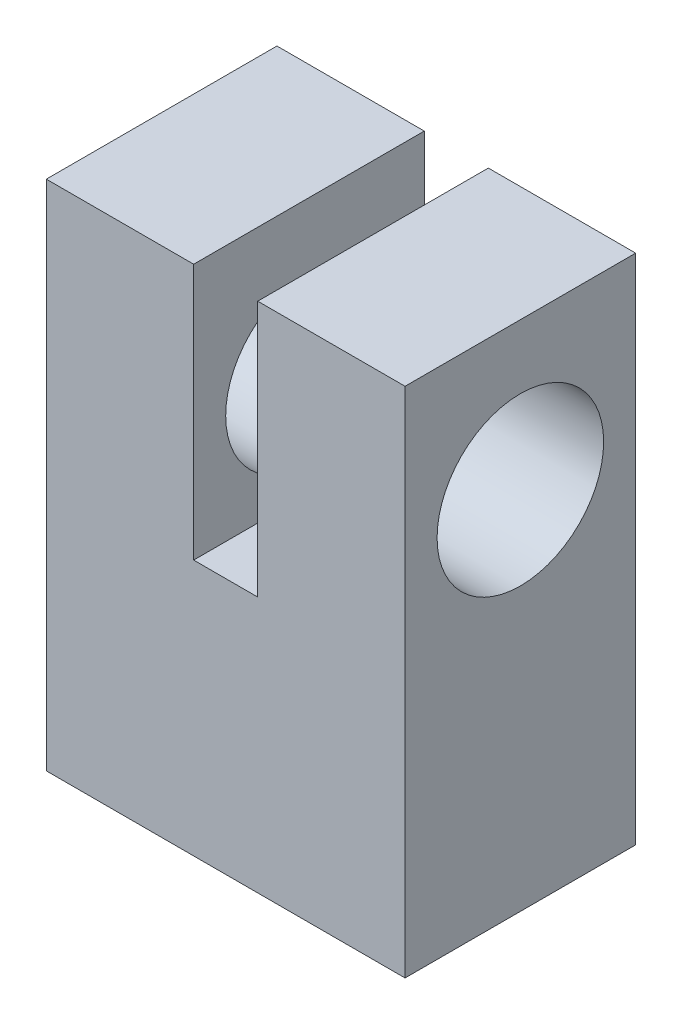
ISO-10303-21;
HEADER;
FILE_DESCRIPTION(('STEP AP214'),'2;1');
FILE_NAME('part.step','',(''),(''),'','','');
FILE_SCHEMA(('AUTOMOTIVE_DESIGN { 1 0 10303 214 1 1 1 1 }'));
ENDSEC;
DATA;
#1=APPLICATION_CONTEXT('core data for automotive mechanical design processes');
#2=APPLICATION_PROTOCOL_DEFINITION('international standard','automotive_design',2000,#1);
#3=PRODUCT_CONTEXT('',#1,'mechanical');
#4=PRODUCT('Part','Part','',(#3));
#5=PRODUCT_RELATED_PRODUCT_CATEGORY('part','',(#4));
#6=PRODUCT_DEFINITION_FORMATION('','',#4);
#7=PRODUCT_DEFINITION_CONTEXT('part definition',#1,'design');
#8=PRODUCT_DEFINITION('design','',#6,#7);
#9=PRODUCT_DEFINITION_SHAPE('','',#8);
#10=(LENGTH_UNIT() NAMED_UNIT(*) SI_UNIT(.MILLI.,.METRE.));
#11=(NAMED_UNIT(*) PLANE_ANGLE_UNIT() SI_UNIT($,.RADIAN.));
#12=(NAMED_UNIT(*) SI_UNIT($,.STERADIAN.) SOLID_ANGLE_UNIT());
#13=UNCERTAINTY_MEASURE_WITH_UNIT(LENGTH_MEASURE(1.E-05),#10,'distance_accuracy_value','');
#14=(GEOMETRIC_REPRESENTATION_CONTEXT(3) GLOBAL_UNCERTAINTY_ASSIGNED_CONTEXT((#13)) GLOBAL_UNIT_ASSIGNED_CONTEXT((#10,
#11,#12)) REPRESENTATION_CONTEXT('',''));
#15=CARTESIAN_POINT('',(0.,0.,0.));
#16=DIRECTION('',(0.,0.,1.));
#17=DIRECTION('',(1.,0.,0.));
#18=AXIS2_PLACEMENT_3D('',#15,#16,#17);
#19=CARTESIAN_POINT('',(0.,40.,0.));
#20=DIRECTION('',(0.,1.,0.));
#21=DIRECTION('',(0.,0.,1.));
#22=AXIS2_PLACEMENT_3D('',#19,#20,#21);
#23=PLANE('',#22);
#24=DIRECTION('',(0.,0.,1.));
#25=VECTOR('',#24,1.);
#26=CARTESIAN_POINT('',(16.5,40.,-18.));
#27=LINE('',#26,#25);
#28=CARTESIAN_POINT('',(16.5,40.,-18.));
#29=VERTEX_POINT('',#28);
#30=CARTESIAN_POINT('',(16.5,40.,0.));
#31=VERTEX_POINT('',#30);
#32=EDGE_CURVE('E151',#29,#31,#27,.T.);
#33=ORIENTED_EDGE('',*,*,#32,.T.);
#34=DIRECTION('',(1.,0.,0.));
#35=VECTOR('',#34,1.);
#36=CARTESIAN_POINT('',(0.,40.,0.));
#37=LINE('',#36,#35);
#38=CARTESIAN_POINT('',(28.,40.,0.));
#39=VERTEX_POINT('',#38);
#40=EDGE_CURVE('E183',#31,#39,#37,.T.);
#41=ORIENTED_EDGE('',*,*,#40,.T.);
#42=DIRECTION('',(0.,0.,-1.));
#43=VECTOR('',#42,1.);
#44=CARTESIAN_POINT('',(28.,40.,0.));
#45=LINE('',#44,#43);
#46=CARTESIAN_POINT('',(28.,40.,-18.));
#47=VERTEX_POINT('',#46);
#48=EDGE_CURVE('E185',#39,#47,#45,.T.);
#49=ORIENTED_EDGE('',*,*,#48,.T.);
#50=DIRECTION('',(-1.,0.,0.));
#51=VECTOR('',#50,1.);
#52=CARTESIAN_POINT('',(28.,40.,-18.));
#53=LINE('',#52,#51);
#54=EDGE_CURVE('E187',#47,#29,#53,.T.);
#55=ORIENTED_EDGE('',*,*,#54,.T.);
#56=EDGE_LOOP('',(#33,#41,#49,#55));
#57=FACE_BOUND('',#56,.T.);
#58=ADVANCED_FACE('F48',(#57),#23,.T.);
#59=CARTESIAN_POINT('',(0.,40.,-18.));
#60=DIRECTION('',(1.,0.,0.));
#61=DIRECTION('',(0.,0.,-1.));
#62=AXIS2_PLACEMENT_3D('',#59,#60,#61);
#63=PLANE('',#62);
#64=DIRECTION('',(0.,0.,1.));
#65=VECTOR('',#64,1.);
#66=CARTESIAN_POINT('',(0.,0.,-18.));
#67=LINE('',#66,#65);
#68=CARTESIAN_POINT('',(0.,0.,-18.));
#69=VERTEX_POINT('',#68);
#70=CARTESIAN_POINT('',(0.,0.,0.));
#71=VERTEX_POINT('',#70);
#72=EDGE_CURVE('E178',#69,#71,#67,.T.);
#73=ORIENTED_EDGE('',*,*,#72,.T.);
#74=DIRECTION('',(0.,-1.,0.));
#75=VECTOR('',#74,1.);
#76=CARTESIAN_POINT('',(0.,40.,0.));
#77=LINE('',#76,#75);
#78=CARTESIAN_POINT('',(0.,40.,0.));
#79=VERTEX_POINT('',#78);
#80=EDGE_CURVE('E13',#79,#71,#77,.T.);
#81=ORIENTED_EDGE('',*,*,#80,.F.);
#82=DIRECTION('',(0.,0.,1.));
#83=VECTOR('',#82,1.);
#84=CARTESIAN_POINT('',(0.,40.,-18.));
#85=LINE('',#84,#83);
#86=CARTESIAN_POINT('',(0.,40.,-18.));
#87=VERTEX_POINT('',#86);
#88=EDGE_CURVE('E181',#87,#79,#85,.T.);
#89=ORIENTED_EDGE('',*,*,#88,.F.);
#90=DIRECTION('',(0.,-1.,0.));
#91=VECTOR('',#90,1.);
#92=CARTESIAN_POINT('',(0.,40.,-18.));
#93=LINE('',#92,#91);
#94=EDGE_CURVE('E190',#87,#69,#93,.T.);
#95=ORIENTED_EDGE('',*,*,#94,.T.);
#96=EDGE_LOOP('',(#73,#81,#89,#95));
#97=FACE_BOUND('',#96,.T.);
#98=CARTESIAN_POINT('',(0.,28.5,-9.));
#99=DIRECTION('',(-1.,0.,0.));
#100=DIRECTION('',(0.,0.,1.));
#101=AXIS2_PLACEMENT_3D('',#98,#99,#100);
#102=CIRCLE('',#101,6.5);
#103=CARTESIAN_POINT('',(0.,28.5,-2.5));
#104=VERTEX_POINT('',#103);
#105=EDGE_CURVE('E448',#104,#104,#102,.T.);
#106=ORIENTED_EDGE('',*,*,#105,.F.);
#107=EDGE_LOOP('',(#106));
#108=FACE_BOUND('',#107,.T.);
#109=ADVANCED_FACE('F50',(#97,#108),#63,.F.);
#110=CARTESIAN_POINT('',(0.,40.,0.));
#111=DIRECTION('',(0.,0.,-1.));
#112=DIRECTION('',(-1.,0.,0.));
#113=AXIS2_PLACEMENT_3D('',#110,#111,#112);
#114=PLANE('',#113);
#115=ORIENTED_EDGE('',*,*,#40,.F.);
#116=DIRECTION('',(0.,1.,0.));
#117=VECTOR('',#116,1.);
#118=CARTESIAN_POINT('',(16.5,20.,0.));
#119=LINE('',#118,#117);
#120=CARTESIAN_POINT('',(16.5,20.,0.));
#121=VERTEX_POINT('',#120);
#122=EDGE_CURVE('E140',#121,#31,#119,.T.);
#123=ORIENTED_EDGE('',*,*,#122,.F.);
#124=DIRECTION('',(1.,0.,0.));
#125=VECTOR('',#124,1.);
#126=CARTESIAN_POINT('',(11.5,20.,0.));
#127=LINE('',#126,#125);
#128=CARTESIAN_POINT('',(11.5,20.,0.));
#129=VERTEX_POINT('',#128);
#130=EDGE_CURVE('E142',#129,#121,#127,.T.);
#131=ORIENTED_EDGE('',*,*,#130,.F.);
#132=DIRECTION('',(0.,-1.,0.));
#133=VECTOR('',#132,1.);
#134=CARTESIAN_POINT('',(11.5,40.,0.));
#135=LINE('',#134,#133);
#136=CARTESIAN_POINT('',(11.5,40.,0.));
#137=VERTEX_POINT('',#136);
#138=EDGE_CURVE('E125',#137,#129,#135,.T.);
#139=ORIENTED_EDGE('',*,*,#138,.F.);
#140=EDGE_CURVE('E101',#79,#137,#37,.T.);
#141=ORIENTED_EDGE('',*,*,#140,.F.);
#142=ORIENTED_EDGE('',*,*,#80,.T.);
#143=DIRECTION('',(1.,0.,0.));
#144=VECTOR('',#143,1.);
#145=CARTESIAN_POINT('',(0.,0.,0.));
#146=LINE('',#145,#144);
#147=CARTESIAN_POINT('',(28.,0.,0.));
#148=VERTEX_POINT('',#147);
#149=EDGE_CURVE('E193',#71,#148,#146,.T.);
#150=ORIENTED_EDGE('',*,*,#149,.T.);
#151=DIRECTION('',(0.,-1.,0.));
#152=VECTOR('',#151,1.);
#153=CARTESIAN_POINT('',(28.,40.,0.));
#154=LINE('',#153,#152);
#155=EDGE_CURVE('E57',#39,#148,#154,.T.);
#156=ORIENTED_EDGE('',*,*,#155,.F.);
#157=EDGE_LOOP('',(#115,#123,#131,#139,#141,#142,#150,#156));
#158=FACE_BOUND('',#157,.T.);
#159=ADVANCED_FACE('F218',(#158),#114,.F.);
#160=CARTESIAN_POINT('',(28.,40.,0.));
#161=DIRECTION('',(-1.,0.,0.));
#162=DIRECTION('',(0.,0.,1.));
#163=AXIS2_PLACEMENT_3D('',#160,#161,#162);
#164=PLANE('',#163);
#165=DIRECTION('',(0.,0.,-1.));
#166=VECTOR('',#165,1.);
#167=CARTESIAN_POINT('',(28.,0.,0.));
#168=LINE('',#167,#166);
#169=CARTESIAN_POINT('',(28.,0.,-18.));
#170=VERTEX_POINT('',#169);
#171=EDGE_CURVE('E195',#148,#170,#168,.T.);
#172=ORIENTED_EDGE('',*,*,#171,.T.);
#173=DIRECTION('',(0.,-1.,0.));
#174=VECTOR('',#173,1.);
#175=CARTESIAN_POINT('',(28.,40.,-18.));
#176=LINE('',#175,#174);
#177=EDGE_CURVE('E199',#47,#170,#176,.T.);
#178=ORIENTED_EDGE('',*,*,#177,.F.);
#179=ORIENTED_EDGE('',*,*,#48,.F.);
#180=ORIENTED_EDGE('',*,*,#155,.T.);
#181=EDGE_LOOP('',(#172,#178,#179,#180));
#182=FACE_BOUND('',#181,.T.);
#183=CARTESIAN_POINT('',(28.,28.5,-9.));
#184=DIRECTION('',(1.,0.,0.));
#185=DIRECTION('',(0.,0.,-1.));
#186=AXIS2_PLACEMENT_3D('',#183,#184,#185);
#187=CIRCLE('',#186,6.5);
#188=CARTESIAN_POINT('',(28.,28.5,-15.5));
#189=VERTEX_POINT('',#188);
#190=EDGE_CURVE('E145',#189,#189,#187,.T.);
#191=ORIENTED_EDGE('',*,*,#190,.F.);
#192=EDGE_LOOP('',(#191));
#193=FACE_BOUND('',#192,.T.);
#194=ADVANCED_FACE('F206',(#182,#193),#164,.F.);
#195=CARTESIAN_POINT('',(28.,40.,-18.));
#196=DIRECTION('',(0.,0.,1.));
#197=DIRECTION('',(1.,0.,0.));
#198=AXIS2_PLACEMENT_3D('',#195,#196,#197);
#199=PLANE('',#198);
#200=DIRECTION('',(1.,0.,0.));
#201=VECTOR('',#200,1.);
#202=CARTESIAN_POINT('',(11.5,20.,-18.));
#203=LINE('',#202,#201);
#204=CARTESIAN_POINT('',(11.5,20.,-18.));
#205=VERTEX_POINT('',#204);
#206=CARTESIAN_POINT('',(16.5,20.,-18.));
#207=VERTEX_POINT('',#206);
#208=EDGE_CURVE('E133',#205,#207,#203,.T.);
#209=ORIENTED_EDGE('',*,*,#208,.T.);
#210=DIRECTION('',(0.,1.,0.));
#211=VECTOR('',#210,1.);
#212=CARTESIAN_POINT('',(16.5,20.,-18.));
#213=LINE('',#212,#211);
#214=EDGE_CURVE('E137',#207,#29,#213,.T.);
#215=ORIENTED_EDGE('',*,*,#214,.T.);
#216=ORIENTED_EDGE('',*,*,#54,.F.);
#217=ORIENTED_EDGE('',*,*,#177,.T.);
#218=DIRECTION('',(-1.,0.,0.));
#219=VECTOR('',#218,1.);
#220=CARTESIAN_POINT('',(28.,0.,-18.));
#221=LINE('',#220,#219);
#222=EDGE_CURVE('E94',#170,#69,#221,.T.);
#223=ORIENTED_EDGE('',*,*,#222,.T.);
#224=ORIENTED_EDGE('',*,*,#94,.F.);
#225=CARTESIAN_POINT('',(11.5,40.,-18.));
#226=VERTEX_POINT('',#225);
#227=EDGE_CURVE('E72',#226,#87,#53,.T.);
#228=ORIENTED_EDGE('',*,*,#227,.F.);
#229=DIRECTION('',(0.,-1.,0.));
#230=VECTOR('',#229,1.);
#231=CARTESIAN_POINT('',(11.5,40.,-18.));
#232=LINE('',#231,#230);
#233=EDGE_CURVE('E64',#226,#205,#232,.T.);
#234=ORIENTED_EDGE('',*,*,#233,.T.);
#235=EDGE_LOOP('',(#209,#215,#216,#217,#223,#224,#228,#234));
#236=FACE_BOUND('',#235,.T.);
#237=ADVANCED_FACE('F139',(#236),#199,.F.);
#238=DIRECTION('',(0.,0.,1.));
#239=VECTOR('',#238,1.);
#240=CARTESIAN_POINT('',(11.5,40.,-18.));
#241=LINE('',#240,#239);
#242=EDGE_CURVE('E130',#226,#137,#241,.T.);
#243=ORIENTED_EDGE('',*,*,#242,.F.);
#244=ORIENTED_EDGE('',*,*,#227,.T.);
#245=ORIENTED_EDGE('',*,*,#88,.T.);
#246=ORIENTED_EDGE('',*,*,#140,.T.);
#247=EDGE_LOOP('',(#243,#244,#245,#246));
#248=FACE_BOUND('',#247,.T.);
#249=ADVANCED_FACE('F217',(#248),#23,.T.);
#250=CARTESIAN_POINT('',(0.,0.,0.));
#251=DIRECTION('',(0.,1.,0.));
#252=DIRECTION('',(0.,0.,1.));
#253=AXIS2_PLACEMENT_3D('',#250,#251,#252);
#254=PLANE('',#253);
#255=CARTESIAN_POINT('',(22.,0.,-5.5));
#256=DIRECTION('',(0.,-1.,0.));
#257=DIRECTION('',(0.,0.,1.));
#258=AXIS2_PLACEMENT_3D('',#255,#256,#257);
#259=CIRCLE('',#258,2.);
#260=CARTESIAN_POINT('',(22.,0.,-3.5));
#261=VERTEX_POINT('',#260);
#262=EDGE_CURVE('E154',#261,#261,#259,.T.);
#263=ORIENTED_EDGE('',*,*,#262,.F.);
#264=EDGE_LOOP('',(#263));
#265=FACE_BOUND('',#264,.T.);
#266=CARTESIAN_POINT('',(22.,0.,-12.5));
#267=DIRECTION('',(0.,-1.,0.));
#268=DIRECTION('',(0.,0.,1.));
#269=AXIS2_PLACEMENT_3D('',#266,#267,#268);
#270=CIRCLE('',#269,2.);
#271=CARTESIAN_POINT('',(22.,0.,-10.5));
#272=VERTEX_POINT('',#271);
#273=EDGE_CURVE('E167',#272,#272,#270,.T.);
#274=ORIENTED_EDGE('',*,*,#273,.F.);
#275=EDGE_LOOP('',(#274));
#276=FACE_BOUND('',#275,.T.);
#277=CARTESIAN_POINT('',(6.,0.,-12.5));
#278=DIRECTION('',(0.,-1.,0.));
#279=DIRECTION('',(0.,0.,-1.));
#280=AXIS2_PLACEMENT_3D('',#277,#278,#279);
#281=CIRCLE('',#280,2.);
#282=CARTESIAN_POINT('',(6.,0.,-14.5));
#283=VERTEX_POINT('',#282);
#284=EDGE_CURVE('E161',#283,#283,#281,.T.);
#285=ORIENTED_EDGE('',*,*,#284,.F.);
#286=EDGE_LOOP('',(#285));
#287=FACE_BOUND('',#286,.T.);
#288=CARTESIAN_POINT('',(6.,0.,-5.5));
#289=DIRECTION('',(0.,-1.,0.));
#290=DIRECTION('',(0.,0.,-1.));
#291=AXIS2_PLACEMENT_3D('',#288,#289,#290);
#292=CIRCLE('',#291,2.);
#293=CARTESIAN_POINT('',(6.,0.,-7.5));
#294=VERTEX_POINT('',#293);
#295=EDGE_CURVE('E160',#294,#294,#292,.T.);
#296=ORIENTED_EDGE('',*,*,#295,.F.);
#297=EDGE_LOOP('',(#296));
#298=FACE_BOUND('',#297,.T.);
#299=ORIENTED_EDGE('',*,*,#72,.F.);
#300=ORIENTED_EDGE('',*,*,#222,.F.);
#301=ORIENTED_EDGE('',*,*,#171,.F.);
#302=ORIENTED_EDGE('',*,*,#149,.F.);
#303=EDGE_LOOP('',(#299,#300,#301,#302));
#304=FACE_BOUND('',#303,.T.);
#305=ADVANCED_FACE('F212',(#265,#276,#287,#298,#304),#254,.F.);
#306=CARTESIAN_POINT('',(6.,15.,-5.5));
#307=DIRECTION('',(0.,-1.,0.));
#308=DIRECTION('',(0.,0.,-1.));
#309=AXIS2_PLACEMENT_3D('',#306,#307,#308);
#310=CYLINDRICAL_SURFACE('',#309,2.);
#311=CARTESIAN_POINT('',(6.,15.,-5.5));
#312=DIRECTION('',(0.,-1.,0.));
#313=DIRECTION('',(0.,0.,-1.));
#314=AXIS2_PLACEMENT_3D('',#311,#312,#313);
#315=CIRCLE('',#314,2.);
#316=CARTESIAN_POINT('',(6.,15.,-7.5));
#317=VERTEX_POINT('',#316);
#318=EDGE_CURVE('E175',#317,#317,#315,.T.);
#319=ORIENTED_EDGE('',*,*,#318,.F.);
#320=EDGE_LOOP('',(#319));
#321=FACE_BOUND('',#320,.T.);
#322=ORIENTED_EDGE('',*,*,#295,.T.);
#323=EDGE_LOOP('',(#322));
#324=FACE_BOUND('',#323,.T.);
#325=ADVANCED_FACE('F236',(#321,#324),#310,.F.);
#326=CARTESIAN_POINT('',(6.,15.,-5.5));
#327=DIRECTION('',(0.,-1.,0.));
#328=DIRECTION('',(0.,0.,-1.));
#329=AXIS2_PLACEMENT_3D('',#326,#327,#328);
#330=PLANE('',#329);
#331=ORIENTED_EDGE('',*,*,#318,.T.);
#332=EDGE_LOOP('',(#331));
#333=FACE_BOUND('',#332,.T.);
#334=ADVANCED_FACE('F320',(#333),#330,.T.);
#335=CARTESIAN_POINT('',(6.,15.,-12.5));
#336=DIRECTION('',(0.,-1.,0.));
#337=DIRECTION('',(0.,0.,-1.));
#338=AXIS2_PLACEMENT_3D('',#335,#336,#337);
#339=CYLINDRICAL_SURFACE('',#338,2.);
#340=CARTESIAN_POINT('',(6.,15.,-12.5));
#341=DIRECTION('',(0.,-1.,0.));
#342=DIRECTION('',(0.,0.,-1.));
#343=AXIS2_PLACEMENT_3D('',#340,#341,#342);
#344=CIRCLE('',#343,2.);
#345=CARTESIAN_POINT('',(6.,15.,-14.5));
#346=VERTEX_POINT('',#345);
#347=EDGE_CURVE('E157',#346,#346,#344,.T.);
#348=ORIENTED_EDGE('',*,*,#347,.F.);
#349=EDGE_LOOP('',(#348));
#350=FACE_BOUND('',#349,.T.);
#351=ORIENTED_EDGE('',*,*,#284,.T.);
#352=EDGE_LOOP('',(#351));
#353=FACE_BOUND('',#352,.T.);
#354=ADVANCED_FACE('F316',(#350,#353),#339,.F.);
#355=CARTESIAN_POINT('',(6.,15.,-12.5));
#356=DIRECTION('',(0.,-1.,0.));
#357=DIRECTION('',(0.,0.,-1.));
#358=AXIS2_PLACEMENT_3D('',#355,#356,#357);
#359=PLANE('',#358);
#360=ORIENTED_EDGE('',*,*,#347,.T.);
#361=EDGE_LOOP('',(#360));
#362=FACE_BOUND('',#361,.T.);
#363=ADVANCED_FACE('F312',(#362),#359,.T.);
#364=CARTESIAN_POINT('',(22.,15.,-12.5));
#365=DIRECTION('',(0.,-1.,0.));
#366=DIRECTION('',(0.,0.,-1.));
#367=AXIS2_PLACEMENT_3D('',#364,#365,#366);
#368=CYLINDRICAL_SURFACE('',#367,2.);
#369=CARTESIAN_POINT('',(22.,15.,-12.5));
#370=DIRECTION('',(0.,-1.,0.));
#371=DIRECTION('',(0.,0.,1.));
#372=AXIS2_PLACEMENT_3D('',#369,#370,#371);
#373=CIRCLE('',#372,2.);
#374=CARTESIAN_POINT('',(22.,15.,-10.5));
#375=VERTEX_POINT('',#374);
#376=EDGE_CURVE('E164',#375,#375,#373,.T.);
#377=ORIENTED_EDGE('',*,*,#376,.F.);
#378=EDGE_LOOP('',(#377));
#379=FACE_BOUND('',#378,.T.);
#380=ORIENTED_EDGE('',*,*,#273,.T.);
#381=EDGE_LOOP('',(#380));
#382=FACE_BOUND('',#381,.T.);
#383=ADVANCED_FACE('F315',(#379,#382),#368,.F.);
#384=CARTESIAN_POINT('',(22.,15.,-12.5));
#385=DIRECTION('',(0.,1.,0.));
#386=DIRECTION('',(0.,0.,1.));
#387=AXIS2_PLACEMENT_3D('',#384,#385,#386);
#388=PLANE('',#387);
#389=ORIENTED_EDGE('',*,*,#376,.T.);
#390=EDGE_LOOP('',(#389));
#391=FACE_BOUND('',#390,.T.);
#392=ADVANCED_FACE('F322',(#391),#388,.F.);
#393=CARTESIAN_POINT('',(22.,15.,-5.5));
#394=DIRECTION('',(0.,-1.,0.));
#395=DIRECTION('',(0.,0.,-1.));
#396=AXIS2_PLACEMENT_3D('',#393,#394,#395);
#397=CYLINDRICAL_SURFACE('',#396,2.);
#398=CARTESIAN_POINT('',(22.,15.,-5.5));
#399=DIRECTION('',(0.,-1.,0.));
#400=DIRECTION('',(0.,0.,1.));
#401=AXIS2_PLACEMENT_3D('',#398,#399,#400);
#402=CIRCLE('',#401,2.);
#403=CARTESIAN_POINT('',(22.,15.,-3.5));
#404=VERTEX_POINT('',#403);
#405=EDGE_CURVE('E170',#404,#404,#402,.T.);
#406=ORIENTED_EDGE('',*,*,#405,.F.);
#407=EDGE_LOOP('',(#406));
#408=FACE_BOUND('',#407,.T.);
#409=ORIENTED_EDGE('',*,*,#262,.T.);
#410=EDGE_LOOP('',(#409));
#411=FACE_BOUND('',#410,.T.);
#412=ADVANCED_FACE('F325',(#408,#411),#397,.F.);
#413=CARTESIAN_POINT('',(22.,15.,-5.5));
#414=DIRECTION('',(0.,1.,0.));
#415=DIRECTION('',(0.,0.,1.));
#416=AXIS2_PLACEMENT_3D('',#413,#414,#415);
#417=PLANE('',#416);
#418=ORIENTED_EDGE('',*,*,#405,.T.);
#419=EDGE_LOOP('',(#418));
#420=FACE_BOUND('',#419,.T.);
#421=ADVANCED_FACE('F275',(#420),#417,.F.);
#422=CARTESIAN_POINT('',(23.6,28.5,-9.));
#423=DIRECTION('',(1.,0.,0.));
#424=DIRECTION('',(0.,0.,-1.));
#425=AXIS2_PLACEMENT_3D('',#422,#423,#424);
#426=CYLINDRICAL_SURFACE('',#425,6.5);
#427=ORIENTED_EDGE('',*,*,#190,.T.);
#428=EDGE_LOOP('',(#427));
#429=FACE_BOUND('',#428,.T.);
#430=CARTESIAN_POINT('',(16.5,28.5,-9.));
#431=DIRECTION('',(1.,0.,0.));
#432=DIRECTION('',(0.,0.,-1.));
#433=AXIS2_PLACEMENT_3D('',#430,#431,#432);
#434=CIRCLE('',#433,6.5);
#435=CARTESIAN_POINT('',(16.5,28.5,-15.5));
#436=VERTEX_POINT('',#435);
#437=EDGE_CURVE('E446',#436,#436,#434,.T.);
#438=ORIENTED_EDGE('',*,*,#437,.F.);
#439=EDGE_LOOP('',(#438));
#440=FACE_BOUND('',#439,.T.);
#441=ADVANCED_FACE('F269',(#429,#440),#426,.F.);
#442=CARTESIAN_POINT('',(4.4,28.5,-9.));
#443=DIRECTION('',(-1.,0.,0.));
#444=DIRECTION('',(0.,0.,1.));
#445=AXIS2_PLACEMENT_3D('',#442,#443,#444);
#446=CYLINDRICAL_SURFACE('',#445,6.5);
#447=ORIENTED_EDGE('',*,*,#105,.T.);
#448=EDGE_LOOP('',(#447));
#449=FACE_BOUND('',#448,.T.);
#450=CARTESIAN_POINT('',(11.5,28.5,-9.));
#451=DIRECTION('',(-1.,0.,0.));
#452=DIRECTION('',(0.,0.,1.));
#453=AXIS2_PLACEMENT_3D('',#450,#451,#452);
#454=CIRCLE('',#453,6.5);
#455=CARTESIAN_POINT('',(11.5,28.5,-2.5));
#456=VERTEX_POINT('',#455);
#457=EDGE_CURVE('E52',#456,#456,#454,.T.);
#458=ORIENTED_EDGE('',*,*,#457,.F.);
#459=EDGE_LOOP('',(#458));
#460=FACE_BOUND('',#459,.T.);
#461=ADVANCED_FACE('F274',(#449,#460),#446,.F.);
#462=CARTESIAN_POINT('',(16.5,20.,-18.));
#463=DIRECTION('',(1.,0.,0.));
#464=DIRECTION('',(0.,0.,-1.));
#465=AXIS2_PLACEMENT_3D('',#462,#463,#464);
#466=PLANE('',#465);
#467=ORIENTED_EDGE('',*,*,#437,.T.);
#468=EDGE_LOOP('',(#467));
#469=FACE_BOUND('',#468,.T.);
#470=ORIENTED_EDGE('',*,*,#122,.T.);
#471=ORIENTED_EDGE('',*,*,#32,.F.);
#472=ORIENTED_EDGE('',*,*,#214,.F.);
#473=DIRECTION('',(0.,0.,1.));
#474=VECTOR('',#473,1.);
#475=CARTESIAN_POINT('',(16.5,20.,-18.));
#476=LINE('',#475,#474);
#477=EDGE_CURVE('E129',#207,#121,#476,.T.);
#478=ORIENTED_EDGE('',*,*,#477,.T.);
#479=EDGE_LOOP('',(#470,#471,#472,#478));
#480=FACE_BOUND('',#479,.T.);
#481=ADVANCED_FACE('F221',(#469,#480),#466,.F.);
#482=CARTESIAN_POINT('',(11.5,40.,-18.));
#483=DIRECTION('',(-1.,0.,0.));
#484=DIRECTION('',(0.,0.,1.));
#485=AXIS2_PLACEMENT_3D('',#482,#483,#484);
#486=PLANE('',#485);
#487=ORIENTED_EDGE('',*,*,#457,.T.);
#488=EDGE_LOOP('',(#487));
#489=FACE_BOUND('',#488,.T.);
#490=ORIENTED_EDGE('',*,*,#138,.T.);
#491=DIRECTION('',(0.,0.,1.));
#492=VECTOR('',#491,1.);
#493=CARTESIAN_POINT('',(11.5,20.,-18.));
#494=LINE('',#493,#492);
#495=EDGE_CURVE('E122',#205,#129,#494,.T.);
#496=ORIENTED_EDGE('',*,*,#495,.F.);
#497=ORIENTED_EDGE('',*,*,#233,.F.);
#498=ORIENTED_EDGE('',*,*,#242,.T.);
#499=EDGE_LOOP('',(#490,#496,#497,#498));
#500=FACE_BOUND('',#499,.T.);
#501=ADVANCED_FACE('F124',(#489,#500),#486,.F.);
#502=CARTESIAN_POINT('',(11.5,20.,-18.));
#503=DIRECTION('',(0.,-1.,0.));
#504=DIRECTION('',(0.,0.,-1.));
#505=AXIS2_PLACEMENT_3D('',#502,#503,#504);
#506=PLANE('',#505);
#507=ORIENTED_EDGE('',*,*,#130,.T.);
#508=ORIENTED_EDGE('',*,*,#477,.F.);
#509=ORIENTED_EDGE('',*,*,#208,.F.);
#510=ORIENTED_EDGE('',*,*,#495,.T.);
#511=EDGE_LOOP('',(#507,#508,#509,#510));
#512=FACE_BOUND('',#511,.T.);
#513=ADVANCED_FACE('F134',(#512),#506,.F.);
#514=CLOSED_SHELL('',(#58,#109,#159,#194,#237,#249,#305,#325,#334,#354,#363,#383,#392,#412,#421,
#441,#461,#481,#501,#513));
#515=MANIFOLD_SOLID_BREP('B2',#514);
#516=ADVANCED_BREP_SHAPE_REPRESENTATION('',(#18,#515),#14);
#517=SHAPE_DEFINITION_REPRESENTATION(#9,#516);
ENDSEC;
END-ISO-10303-21;
